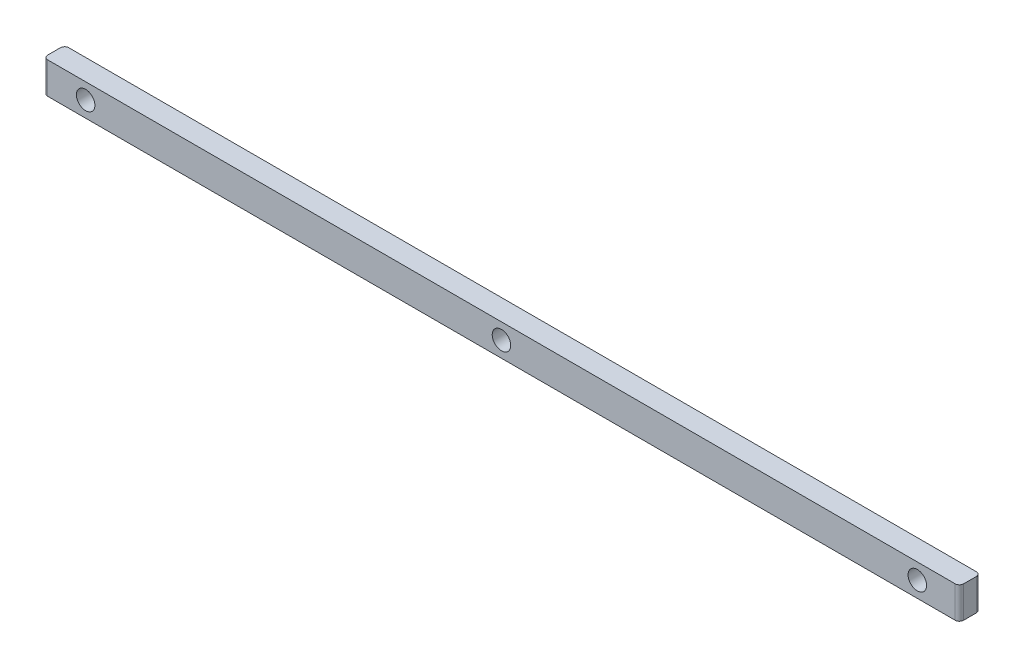
ISO-10303-21;
HEADER;
FILE_DESCRIPTION(('STEP AP214'),'2;1');
FILE_NAME('part.step','',(''),(''),'','','');
FILE_SCHEMA(('AUTOMOTIVE_DESIGN { 1 0 10303 214 1 1 1 1 }'));
ENDSEC;
DATA;
#1=APPLICATION_CONTEXT('core data for automotive mechanical design processes');
#2=APPLICATION_PROTOCOL_DEFINITION('international standard','automotive_design',2000,#1);
#3=PRODUCT_CONTEXT('',#1,'mechanical');
#4=PRODUCT('Part','Part','',(#3));
#5=PRODUCT_RELATED_PRODUCT_CATEGORY('part','',(#4));
#6=PRODUCT_DEFINITION_FORMATION('','',#4);
#7=PRODUCT_DEFINITION_CONTEXT('part definition',#1,'design');
#8=PRODUCT_DEFINITION('design','',#6,#7);
#9=PRODUCT_DEFINITION_SHAPE('','',#8);
#10=(LENGTH_UNIT() NAMED_UNIT(*) SI_UNIT(.MILLI.,.METRE.));
#11=(NAMED_UNIT(*) PLANE_ANGLE_UNIT() SI_UNIT($,.RADIAN.));
#12=(NAMED_UNIT(*) SI_UNIT($,.STERADIAN.) SOLID_ANGLE_UNIT());
#13=UNCERTAINTY_MEASURE_WITH_UNIT(LENGTH_MEASURE(1.E-05),#10,'distance_accuracy_value','');
#14=(GEOMETRIC_REPRESENTATION_CONTEXT(3) GLOBAL_UNCERTAINTY_ASSIGNED_CONTEXT((#13)) GLOBAL_UNIT_ASSIGNED_CONTEXT((#10,
#11,#12)) REPRESENTATION_CONTEXT('',''));
#15=CARTESIAN_POINT('',(0.,0.,0.));
#16=DIRECTION('',(0.,0.,1.));
#17=DIRECTION('',(1.,0.,0.));
#18=AXIS2_PLACEMENT_3D('',#15,#16,#17);
#19=CARTESIAN_POINT('',(276.225,-9.525,6.35));
#20=DIRECTION('',(-1.,0.,0.));
#21=DIRECTION('',(0.,0.,1.));
#22=AXIS2_PLACEMENT_3D('',#19,#20,#21);
#23=PLANE('',#22);
#24=DIRECTION('',(0.,0.,-1.));
#25=VECTOR('',#24,1.);
#26=CARTESIAN_POINT('',(276.225,-9.525,6.35));
#27=LINE('',#26,#25);
#28=CARTESIAN_POINT('',(276.225,-9.525,3.81));
#29=VERTEX_POINT('',#28);
#30=CARTESIAN_POINT('',(276.225,-9.525,-3.81));
#31=VERTEX_POINT('',#30);
#32=EDGE_CURVE('E130',#29,#31,#27,.T.);
#33=ORIENTED_EDGE('',*,*,#32,.T.);
#34=DIRECTION('',(0.,1.,0.));
#35=VECTOR('',#34,1.);
#36=CARTESIAN_POINT('',(276.225,9.525,-3.81));
#37=LINE('',#36,#35);
#38=CARTESIAN_POINT('',(276.225,9.525,-3.81));
#39=VERTEX_POINT('',#38);
#40=EDGE_CURVE('E11',#31,#39,#37,.T.);
#41=ORIENTED_EDGE('',*,*,#40,.T.);
#42=DIRECTION('',(0.,0.,-1.));
#43=VECTOR('',#42,1.);
#44=CARTESIAN_POINT('',(276.225,9.525,6.35));
#45=LINE('',#44,#43);
#46=CARTESIAN_POINT('',(276.225,9.525,3.81));
#47=VERTEX_POINT('',#46);
#48=EDGE_CURVE('E136',#47,#39,#45,.T.);
#49=ORIENTED_EDGE('',*,*,#48,.F.);
#50=DIRECTION('',(0.,1.,0.));
#51=VECTOR('',#50,1.);
#52=CARTESIAN_POINT('',(276.225,-9.525,3.81));
#53=LINE('',#52,#51);
#54=EDGE_CURVE('E48',#47,#29,#53,.F.);
#55=ORIENTED_EDGE('',*,*,#54,.T.);
#56=EDGE_LOOP('',(#33,#41,#49,#55));
#57=FACE_BOUND('',#56,.T.);
#58=ADVANCED_FACE('F39',(#57),#23,.F.);
#59=CARTESIAN_POINT('',(-276.225,9.525,6.35));
#60=DIRECTION('',(0.,-1.,0.));
#61=DIRECTION('',(0.,0.,-1.));
#62=AXIS2_PLACEMENT_3D('',#59,#60,#61);
#63=PLANE('',#62);
#64=DIRECTION('',(-1.,0.,0.));
#65=VECTOR('',#64,1.);
#66=CARTESIAN_POINT('',(-276.225,9.525,-6.35));
#67=LINE('',#66,#65);
#68=CARTESIAN_POINT('',(273.685,9.525,-6.35));
#69=VERTEX_POINT('',#68);
#70=CARTESIAN_POINT('',(-273.685,9.525,-6.35));
#71=VERTEX_POINT('',#70);
#72=EDGE_CURVE('E196',#69,#71,#67,.T.);
#73=ORIENTED_EDGE('',*,*,#72,.T.);
#74=CARTESIAN_POINT('',(-273.685,9.525,-3.81));
#75=DIRECTION('',(0.,-1.,0.));
#76=DIRECTION('',(0.,0.,-1.));
#77=AXIS2_PLACEMENT_3D('',#74,#75,#76);
#78=CIRCLE('',#77,2.54);
#79=CARTESIAN_POINT('',(-276.225,9.525,-3.81));
#80=VERTEX_POINT('',#79);
#81=EDGE_CURVE('E163',#71,#80,#78,.F.);
#82=ORIENTED_EDGE('',*,*,#81,.T.);
#83=DIRECTION('',(0.,0.,-1.));
#84=VECTOR('',#83,1.);
#85=CARTESIAN_POINT('',(-276.225,9.525,6.35));
#86=LINE('',#85,#84);
#87=CARTESIAN_POINT('',(-276.225,9.525,3.81));
#88=VERTEX_POINT('',#87);
#89=EDGE_CURVE('E129',#88,#80,#86,.T.);
#90=ORIENTED_EDGE('',*,*,#89,.F.);
#91=CARTESIAN_POINT('',(-273.685,9.525,3.81));
#92=DIRECTION('',(0.,-1.,0.));
#93=DIRECTION('',(0.,0.,-1.));
#94=AXIS2_PLACEMENT_3D('',#91,#92,#93);
#95=CIRCLE('',#94,2.54);
#96=CARTESIAN_POINT('',(-273.685,9.525,6.35));
#97=VERTEX_POINT('',#96);
#98=EDGE_CURVE('E134',#88,#97,#95,.F.);
#99=ORIENTED_EDGE('',*,*,#98,.T.);
#100=DIRECTION('',(-1.,0.,0.));
#101=VECTOR('',#100,1.);
#102=CARTESIAN_POINT('',(-276.225,9.525,6.35));
#103=LINE('',#102,#101);
#104=CARTESIAN_POINT('',(273.685,9.525,6.35));
#105=VERTEX_POINT('',#104);
#106=EDGE_CURVE('E187',#105,#97,#103,.T.);
#107=ORIENTED_EDGE('',*,*,#106,.F.);
#108=CARTESIAN_POINT('',(273.685,9.525,3.81));
#109=DIRECTION('',(0.,-1.,0.));
#110=DIRECTION('',(0.,0.,-1.));
#111=AXIS2_PLACEMENT_3D('',#108,#109,#110);
#112=CIRCLE('',#111,2.54);
#113=EDGE_CURVE('E62',#105,#47,#112,.F.);
#114=ORIENTED_EDGE('',*,*,#113,.T.);
#115=ORIENTED_EDGE('',*,*,#48,.T.);
#116=CARTESIAN_POINT('',(273.685,9.525,-3.81));
#117=DIRECTION('',(0.,-1.,0.));
#118=DIRECTION('',(0.,0.,-1.));
#119=AXIS2_PLACEMENT_3D('',#116,#117,#118);
#120=CIRCLE('',#119,2.54);
#121=EDGE_CURVE('E55',#39,#69,#120,.F.);
#122=ORIENTED_EDGE('',*,*,#121,.T.);
#123=EDGE_LOOP('',(#73,#82,#90,#99,#107,#114,#115,#122));
#124=FACE_BOUND('',#123,.T.);
#125=ADVANCED_FACE('F189',(#124),#63,.F.);
#126=CARTESIAN_POINT('',(-276.225,-9.525,6.35));
#127=DIRECTION('',(1.,0.,0.));
#128=DIRECTION('',(0.,0.,-1.));
#129=AXIS2_PLACEMENT_3D('',#126,#127,#128);
#130=PLANE('',#129);
#131=ORIENTED_EDGE('',*,*,#89,.T.);
#132=DIRECTION('',(0.,-1.,0.));
#133=VECTOR('',#132,1.);
#134=CARTESIAN_POINT('',(-276.225,-9.525,-3.81));
#135=LINE('',#134,#133);
#136=CARTESIAN_POINT('',(-276.225,-9.525,-3.81));
#137=VERTEX_POINT('',#136);
#138=EDGE_CURVE('E127',#80,#137,#135,.T.);
#139=ORIENTED_EDGE('',*,*,#138,.T.);
#140=DIRECTION('',(0.,0.,-1.));
#141=VECTOR('',#140,1.);
#142=CARTESIAN_POINT('',(-276.225,-9.525,6.35));
#143=LINE('',#142,#141);
#144=CARTESIAN_POINT('',(-276.225,-9.525,3.81));
#145=VERTEX_POINT('',#144);
#146=EDGE_CURVE('E109',#145,#137,#143,.T.);
#147=ORIENTED_EDGE('',*,*,#146,.F.);
#148=DIRECTION('',(0.,-1.,0.));
#149=VECTOR('',#148,1.);
#150=CARTESIAN_POINT('',(-276.225,-9.525,3.81));
#151=LINE('',#150,#149);
#152=EDGE_CURVE('E124',#145,#88,#151,.F.);
#153=ORIENTED_EDGE('',*,*,#152,.T.);
#154=EDGE_LOOP('',(#131,#139,#147,#153));
#155=FACE_BOUND('',#154,.T.);
#156=ADVANCED_FACE('F123',(#155),#130,.F.);
#157=CARTESIAN_POINT('',(-276.225,-9.525,6.35));
#158=DIRECTION('',(0.,1.,0.));
#159=DIRECTION('',(0.,0.,1.));
#160=AXIS2_PLACEMENT_3D('',#157,#158,#159);
#161=PLANE('',#160);
#162=ORIENTED_EDGE('',*,*,#146,.T.);
#163=CARTESIAN_POINT('',(-273.685,-9.525,-3.81));
#164=DIRECTION('',(0.,1.,0.));
#165=DIRECTION('',(0.,0.,1.));
#166=AXIS2_PLACEMENT_3D('',#163,#164,#165);
#167=CIRCLE('',#166,2.54);
#168=CARTESIAN_POINT('',(-273.685,-9.525,-6.35));
#169=VERTEX_POINT('',#168);
#170=EDGE_CURVE('E117',#137,#169,#167,.F.);
#171=ORIENTED_EDGE('',*,*,#170,.T.);
#172=DIRECTION('',(1.,0.,0.));
#173=VECTOR('',#172,1.);
#174=CARTESIAN_POINT('',(-276.225,-9.525,-6.35));
#175=LINE('',#174,#173);
#176=CARTESIAN_POINT('',(273.685,-9.525,-6.35));
#177=VERTEX_POINT('',#176);
#178=EDGE_CURVE('E191',#169,#177,#175,.T.);
#179=ORIENTED_EDGE('',*,*,#178,.T.);
#180=CARTESIAN_POINT('',(273.685,-9.525,-3.81));
#181=DIRECTION('',(0.,1.,0.));
#182=DIRECTION('',(0.,0.,1.));
#183=AXIS2_PLACEMENT_3D('',#180,#181,#182);
#184=CIRCLE('',#183,2.54);
#185=EDGE_CURVE('E118',#177,#31,#184,.F.);
#186=ORIENTED_EDGE('',*,*,#185,.T.);
#187=ORIENTED_EDGE('',*,*,#32,.F.);
#188=CARTESIAN_POINT('',(273.685,-9.525,3.81));
#189=DIRECTION('',(0.,1.,0.));
#190=DIRECTION('',(0.,0.,1.));
#191=AXIS2_PLACEMENT_3D('',#188,#189,#190);
#192=CIRCLE('',#191,2.54);
#193=CARTESIAN_POINT('',(273.685,-9.525,6.35));
#194=VERTEX_POINT('',#193);
#195=EDGE_CURVE('E140',#29,#194,#192,.F.);
#196=ORIENTED_EDGE('',*,*,#195,.T.);
#197=DIRECTION('',(1.,0.,0.));
#198=VECTOR('',#197,1.);
#199=CARTESIAN_POINT('',(-276.225,-9.525,6.35));
#200=LINE('',#199,#198);
#201=CARTESIAN_POINT('',(-273.685,-9.525,6.35));
#202=VERTEX_POINT('',#201);
#203=EDGE_CURVE('E111',#202,#194,#200,.T.);
#204=ORIENTED_EDGE('',*,*,#203,.F.);
#205=CARTESIAN_POINT('',(-273.685,-9.525,3.81));
#206=DIRECTION('',(0.,1.,0.));
#207=DIRECTION('',(0.,0.,1.));
#208=AXIS2_PLACEMENT_3D('',#205,#206,#207);
#209=CIRCLE('',#208,2.54);
#210=EDGE_CURVE('E106',#202,#145,#209,.F.);
#211=ORIENTED_EDGE('',*,*,#210,.T.);
#212=EDGE_LOOP('',(#162,#171,#179,#186,#187,#196,#204,#211));
#213=FACE_BOUND('',#212,.T.);
#214=ADVANCED_FACE('F108',(#213),#161,.F.);
#215=CARTESIAN_POINT('',(0.,0.,6.35));
#216=DIRECTION('',(0.,0.,-1.));
#217=DIRECTION('',(-1.,0.,0.));
#218=AXIS2_PLACEMENT_3D('',#215,#216,#217);
#219=PLANE('',#218);
#220=CARTESIAN_POINT('',(-250.825,0.,6.35));
#221=DIRECTION('',(0.,0.,-1.));
#222=DIRECTION('',(-1.,0.,0.));
#223=AXIS2_PLACEMENT_3D('',#220,#221,#222);
#224=CIRCLE('',#223,5.58800000000002);
#225=CARTESIAN_POINT('',(-256.413,0.,6.35));
#226=VERTEX_POINT('',#225);
#227=EDGE_CURVE('E199',#226,#226,#224,.T.);
#228=ORIENTED_EDGE('',*,*,#227,.T.);
#229=EDGE_LOOP('',(#228));
#230=FACE_BOUND('',#229,.T.);
#231=CARTESIAN_POINT('',(0.,0.,6.35));
#232=DIRECTION('',(0.,0.,-1.));
#233=DIRECTION('',(-1.,0.,0.));
#234=AXIS2_PLACEMENT_3D('',#231,#232,#233);
#235=CIRCLE('',#234,5.588);
#236=CARTESIAN_POINT('',(-5.588,0.,6.35));
#237=VERTEX_POINT('',#236);
#238=EDGE_CURVE('E344',#237,#237,#235,.T.);
#239=ORIENTED_EDGE('',*,*,#238,.T.);
#240=EDGE_LOOP('',(#239));
#241=FACE_BOUND('',#240,.T.);
#242=CARTESIAN_POINT('',(250.825,0.,6.35));
#243=DIRECTION('',(0.,0.,-1.));
#244=DIRECTION('',(-1.,0.,0.));
#245=AXIS2_PLACEMENT_3D('',#242,#243,#244);
#246=CIRCLE('',#245,5.58799999999997);
#247=CARTESIAN_POINT('',(245.237,0.,6.35));
#248=VERTEX_POINT('',#247);
#249=EDGE_CURVE('E341',#248,#248,#246,.T.);
#250=ORIENTED_EDGE('',*,*,#249,.T.);
#251=EDGE_LOOP('',(#250));
#252=FACE_BOUND('',#251,.T.);
#253=ORIENTED_EDGE('',*,*,#106,.T.);
#254=DIRECTION('',(0.,-1.,0.));
#255=VECTOR('',#254,1.);
#256=CARTESIAN_POINT('',(-273.685,0.,6.35));
#257=LINE('',#256,#255);
#258=EDGE_CURVE('E170',#97,#202,#257,.T.);
#259=ORIENTED_EDGE('',*,*,#258,.T.);
#260=ORIENTED_EDGE('',*,*,#203,.T.);
#261=DIRECTION('',(0.,1.,0.));
#262=VECTOR('',#261,1.);
#263=CARTESIAN_POINT('',(273.685,0.,6.35));
#264=LINE('',#263,#262);
#265=EDGE_CURVE('E166',#194,#105,#264,.T.);
#266=ORIENTED_EDGE('',*,*,#265,.T.);
#267=EDGE_LOOP('',(#253,#259,#260,#266));
#268=FACE_BOUND('',#267,.T.);
#269=ADVANCED_FACE('F186',(#230,#241,#252,#268),#219,.F.);
#270=CARTESIAN_POINT('',(0.,0.,-6.35));
#271=DIRECTION('',(0.,0.,-1.));
#272=DIRECTION('',(-1.,0.,0.));
#273=AXIS2_PLACEMENT_3D('',#270,#271,#272);
#274=PLANE('',#273);
#275=CARTESIAN_POINT('',(-250.825,0.,-6.35));
#276=DIRECTION('',(0.,0.,1.));
#277=DIRECTION('',(1.,0.,0.));
#278=AXIS2_PLACEMENT_3D('',#275,#276,#277);
#279=CIRCLE('',#278,5.58800000000002);
#280=CARTESIAN_POINT('',(-245.237,0.,-6.35));
#281=VERTEX_POINT('',#280);
#282=EDGE_CURVE('E327',#281,#281,#279,.T.);
#283=ORIENTED_EDGE('',*,*,#282,.T.);
#284=EDGE_LOOP('',(#283));
#285=FACE_BOUND('',#284,.T.);
#286=CARTESIAN_POINT('',(0.,0.,-6.35));
#287=DIRECTION('',(0.,0.,1.));
#288=DIRECTION('',(1.,0.,0.));
#289=AXIS2_PLACEMENT_3D('',#286,#287,#288);
#290=CIRCLE('',#289,5.588);
#291=CARTESIAN_POINT('',(5.588,0.,-6.35));
#292=VERTEX_POINT('',#291);
#293=EDGE_CURVE('E331',#292,#292,#290,.T.);
#294=ORIENTED_EDGE('',*,*,#293,.T.);
#295=EDGE_LOOP('',(#294));
#296=FACE_BOUND('',#295,.T.);
#297=CARTESIAN_POINT('',(250.825,0.,-6.35));
#298=DIRECTION('',(0.,0.,1.));
#299=DIRECTION('',(1.,0.,0.));
#300=AXIS2_PLACEMENT_3D('',#297,#298,#299);
#301=CIRCLE('',#300,5.58799999999997);
#302=CARTESIAN_POINT('',(256.413,0.,-6.35));
#303=VERTEX_POINT('',#302);
#304=EDGE_CURVE('E334',#303,#303,#301,.T.);
#305=ORIENTED_EDGE('',*,*,#304,.T.);
#306=EDGE_LOOP('',(#305));
#307=FACE_BOUND('',#306,.T.);
#308=ORIENTED_EDGE('',*,*,#178,.F.);
#309=DIRECTION('',(0.,-1.,0.));
#310=VECTOR('',#309,1.);
#311=CARTESIAN_POINT('',(-273.685,9.525,-6.35));
#312=LINE('',#311,#310);
#313=EDGE_CURVE('E154',#169,#71,#312,.F.);
#314=ORIENTED_EDGE('',*,*,#313,.T.);
#315=ORIENTED_EDGE('',*,*,#72,.F.);
#316=DIRECTION('',(0.,1.,0.));
#317=VECTOR('',#316,1.);
#318=CARTESIAN_POINT('',(273.685,-9.525,-6.35));
#319=LINE('',#318,#317);
#320=EDGE_CURVE('E151',#69,#177,#319,.F.);
#321=ORIENTED_EDGE('',*,*,#320,.T.);
#322=EDGE_LOOP('',(#308,#314,#315,#321));
#323=FACE_BOUND('',#322,.T.);
#324=ADVANCED_FACE('F210',(#285,#296,#307,#323),#274,.T.);
#325=CARTESIAN_POINT('',(250.825,0.,-6.35));
#326=DIRECTION('',(0.,0.,1.));
#327=DIRECTION('',(1.,0.,0.));
#328=AXIS2_PLACEMENT_3D('',#325,#326,#327);
#329=CYLINDRICAL_SURFACE('',#328,5.58799999999997);
#330=ORIENTED_EDGE('',*,*,#304,.F.);
#331=EDGE_LOOP('',(#330));
#332=FACE_BOUND('',#331,.T.);
#333=ORIENTED_EDGE('',*,*,#249,.F.);
#334=EDGE_LOOP('',(#333));
#335=FACE_BOUND('',#334,.T.);
#336=ADVANCED_FACE('F238',(#332,#335),#329,.F.);
#337=CARTESIAN_POINT('',(0.,0.,-6.35));
#338=DIRECTION('',(0.,0.,1.));
#339=DIRECTION('',(1.,0.,0.));
#340=AXIS2_PLACEMENT_3D('',#337,#338,#339);
#341=CYLINDRICAL_SURFACE('',#340,5.588);
#342=ORIENTED_EDGE('',*,*,#293,.F.);
#343=EDGE_LOOP('',(#342));
#344=FACE_BOUND('',#343,.T.);
#345=ORIENTED_EDGE('',*,*,#238,.F.);
#346=EDGE_LOOP('',(#345));
#347=FACE_BOUND('',#346,.T.);
#348=ADVANCED_FACE('F232',(#344,#347),#341,.F.);
#349=CARTESIAN_POINT('',(-250.825,0.,-6.35));
#350=DIRECTION('',(0.,0.,1.));
#351=DIRECTION('',(1.,0.,0.));
#352=AXIS2_PLACEMENT_3D('',#349,#350,#351);
#353=CYLINDRICAL_SURFACE('',#352,5.58800000000002);
#354=ORIENTED_EDGE('',*,*,#282,.F.);
#355=EDGE_LOOP('',(#354));
#356=FACE_BOUND('',#355,.T.);
#357=ORIENTED_EDGE('',*,*,#227,.F.);
#358=EDGE_LOOP('',(#357));
#359=FACE_BOUND('',#358,.T.);
#360=ADVANCED_FACE('F228',(#356,#359),#353,.F.);
#361=CARTESIAN_POINT('',(-273.685,-9.525,-3.81));
#362=DIRECTION('',(0.,1.,0.));
#363=DIRECTION('',(0.,0.,1.));
#364=AXIS2_PLACEMENT_3D('',#361,#362,#363);
#365=CYLINDRICAL_SURFACE('',#364,2.54);
#366=ORIENTED_EDGE('',*,*,#81,.F.);
#367=ORIENTED_EDGE('',*,*,#313,.F.);
#368=ORIENTED_EDGE('',*,*,#170,.F.);
#369=ORIENTED_EDGE('',*,*,#138,.F.);
#370=EDGE_LOOP('',(#366,#367,#368,#369));
#371=FACE_BOUND('',#370,.T.);
#372=ADVANCED_FACE('F206',(#371),#365,.T.);
#373=CARTESIAN_POINT('',(-273.685,0.,3.81));
#374=DIRECTION('',(0.,-1.,0.));
#375=DIRECTION('',(0.,0.,-1.));
#376=AXIS2_PLACEMENT_3D('',#373,#374,#375);
#377=CYLINDRICAL_SURFACE('',#376,2.54);
#378=ORIENTED_EDGE('',*,*,#98,.F.);
#379=ORIENTED_EDGE('',*,*,#152,.F.);
#380=ORIENTED_EDGE('',*,*,#210,.F.);
#381=ORIENTED_EDGE('',*,*,#258,.F.);
#382=EDGE_LOOP('',(#378,#379,#380,#381));
#383=FACE_BOUND('',#382,.T.);
#384=ADVANCED_FACE('F133',(#383),#377,.T.);
#385=CARTESIAN_POINT('',(273.685,-9.525,-3.81));
#386=DIRECTION('',(0.,-1.,0.));
#387=DIRECTION('',(0.,0.,-1.));
#388=AXIS2_PLACEMENT_3D('',#385,#386,#387);
#389=CYLINDRICAL_SURFACE('',#388,2.54);
#390=ORIENTED_EDGE('',*,*,#185,.F.);
#391=ORIENTED_EDGE('',*,*,#320,.F.);
#392=ORIENTED_EDGE('',*,*,#121,.F.);
#393=ORIENTED_EDGE('',*,*,#40,.F.);
#394=EDGE_LOOP('',(#390,#391,#392,#393));
#395=FACE_BOUND('',#394,.T.);
#396=ADVANCED_FACE('F212',(#395),#389,.T.);
#397=CARTESIAN_POINT('',(273.685,0.,3.81));
#398=DIRECTION('',(0.,1.,0.));
#399=DIRECTION('',(0.,0.,1.));
#400=AXIS2_PLACEMENT_3D('',#397,#398,#399);
#401=CYLINDRICAL_SURFACE('',#400,2.54);
#402=ORIENTED_EDGE('',*,*,#195,.F.);
#403=ORIENTED_EDGE('',*,*,#54,.F.);
#404=ORIENTED_EDGE('',*,*,#113,.F.);
#405=ORIENTED_EDGE('',*,*,#265,.F.);
#406=EDGE_LOOP('',(#402,#403,#404,#405));
#407=FACE_BOUND('',#406,.T.);
#408=ADVANCED_FACE('F41',(#407),#401,.T.);
#409=CLOSED_SHELL('',(#58,#125,#156,#214,#269,#324,#336,#348,#360,#372,#384,#396,#408));
#410=MANIFOLD_SOLID_BREP('B2',#409);
#411=ADVANCED_BREP_SHAPE_REPRESENTATION('',(#18,#410),#14);
#412=SHAPE_DEFINITION_REPRESENTATION(#9,#411);
ENDSEC;
END-ISO-10303-21;
